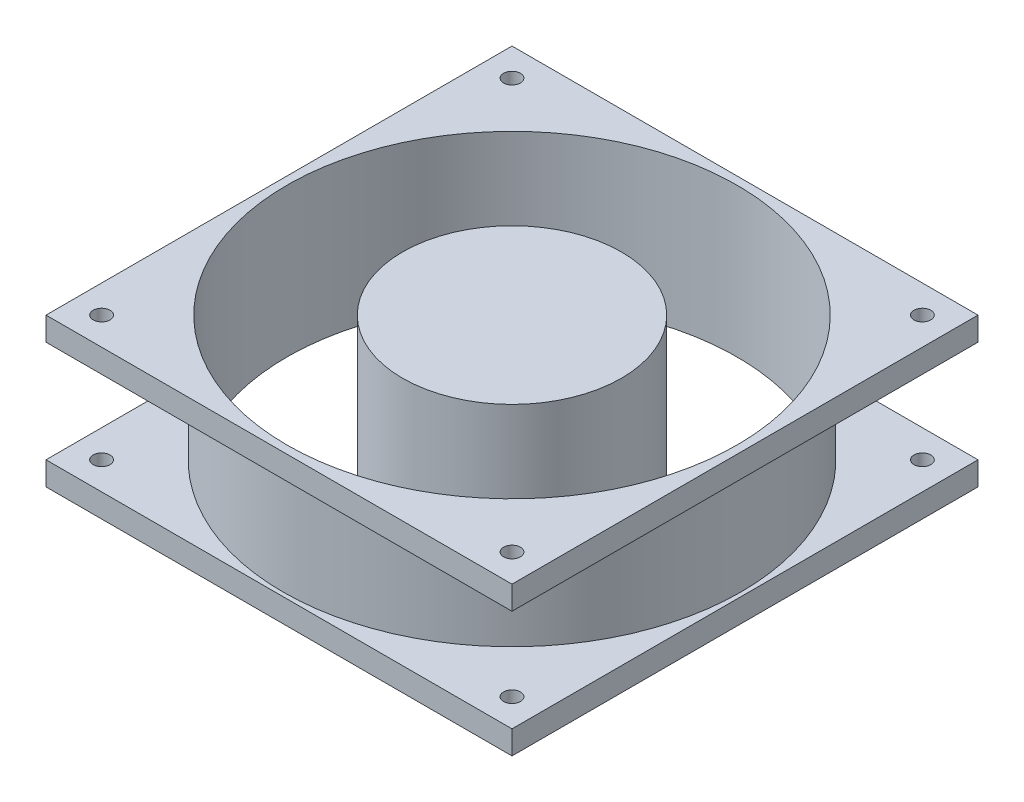
ISO-10303-21;
HEADER;
FILE_DESCRIPTION(('STEP AP214'),'2;1');
FILE_NAME('part.step','',(''),(''),'','','');
FILE_SCHEMA(('AUTOMOTIVE_DESIGN { 1 0 10303 214 1 1 1 1 }'));
ENDSEC;
DATA;
#1=APPLICATION_CONTEXT('core data for automotive mechanical design processes');
#2=APPLICATION_PROTOCOL_DEFINITION('international standard','automotive_design',2000,#1);
#3=PRODUCT_CONTEXT('',#1,'mechanical');
#4=PRODUCT('Part','Part','',(#3));
#5=PRODUCT_RELATED_PRODUCT_CATEGORY('part','',(#4));
#6=PRODUCT_DEFINITION_FORMATION('','',#4);
#7=PRODUCT_DEFINITION_CONTEXT('part definition',#1,'design');
#8=PRODUCT_DEFINITION('design','',#6,#7);
#9=PRODUCT_DEFINITION_SHAPE('','',#8);
#10=(LENGTH_UNIT() NAMED_UNIT(*) SI_UNIT(.MILLI.,.METRE.));
#11=(NAMED_UNIT(*) PLANE_ANGLE_UNIT() SI_UNIT($,.RADIAN.));
#12=(NAMED_UNIT(*) SI_UNIT($,.STERADIAN.) SOLID_ANGLE_UNIT());
#13=UNCERTAINTY_MEASURE_WITH_UNIT(LENGTH_MEASURE(1.E-05),#10,'distance_accuracy_value','');
#14=(GEOMETRIC_REPRESENTATION_CONTEXT(3) GLOBAL_UNCERTAINTY_ASSIGNED_CONTEXT((#13)) GLOBAL_UNIT_ASSIGNED_CONTEXT((#10,
#11,#12)) REPRESENTATION_CONTEXT('',''));
#15=CARTESIAN_POINT('',(0.,0.,0.));
#16=DIRECTION('',(0.,0.,1.));
#17=DIRECTION('',(1.,0.,0.));
#18=AXIS2_PLACEMENT_3D('',#15,#16,#17);
#19=CARTESIAN_POINT('',(0.,19.,0.));
#20=DIRECTION('',(0.,-1.,0.));
#21=DIRECTION('',(0.,0.,-1.));
#22=AXIS2_PLACEMENT_3D('',#19,#20,#21);
#23=CYLINDRICAL_SURFACE('',#22,27.94);
#24=CARTESIAN_POINT('',(0.,19.,0.));
#25=DIRECTION('',(0.,1.,0.));
#26=DIRECTION('',(0.,0.,1.));
#27=AXIS2_PLACEMENT_3D('',#24,#25,#26);
#28=CIRCLE('',#27,27.94);
#29=CARTESIAN_POINT('',(0.,19.,27.94));
#30=VERTEX_POINT('',#29);
#31=EDGE_CURVE('E11',#30,#30,#28,.T.);
#32=ORIENTED_EDGE('',*,*,#31,.F.);
#33=EDGE_LOOP('',(#32));
#34=FACE_BOUND('',#33,.T.);
#35=CARTESIAN_POINT('',(0.,-19.,0.));
#36=DIRECTION('',(0.,1.,0.));
#37=DIRECTION('',(0.,0.,1.));
#38=AXIS2_PLACEMENT_3D('',#35,#36,#37);
#39=CIRCLE('',#38,27.94);
#40=CARTESIAN_POINT('',(0.,-19.,27.94));
#41=VERTEX_POINT('',#40);
#42=EDGE_CURVE('E47',#41,#41,#39,.T.);
#43=ORIENTED_EDGE('',*,*,#42,.T.);
#44=EDGE_LOOP('',(#43));
#45=FACE_BOUND('',#44,.T.);
#46=ADVANCED_FACE('F44',(#34,#45),#23,.T.);
#47=CARTESIAN_POINT('',(0.,19.,0.));
#48=DIRECTION('',(0.,1.,0.));
#49=DIRECTION('',(0.,0.,1.));
#50=AXIS2_PLACEMENT_3D('',#47,#48,#49);
#51=PLANE('',#50);
#52=ORIENTED_EDGE('',*,*,#31,.T.);
#53=EDGE_LOOP('',(#52));
#54=FACE_BOUND('',#53,.T.);
#55=ADVANCED_FACE('F59',(#54),#51,.T.);
#56=CARTESIAN_POINT('',(0.,-19.,0.));
#57=DIRECTION('',(0.,1.,0.));
#58=DIRECTION('',(0.,0.,1.));
#59=AXIS2_PLACEMENT_3D('',#56,#57,#58);
#60=PLANE('',#59);
#61=ORIENTED_EDGE('',*,*,#42,.F.);
#62=EDGE_LOOP('',(#61));
#63=FACE_BOUND('',#62,.T.);
#64=ADVANCED_FACE('F57',(#63),#60,.F.);
#65=CLOSED_SHELL('',(#46,#55,#64));
#66=MANIFOLD_SOLID_BREP('B2',#65);
#67=CARTESIAN_POINT('',(0.,-13.,0.));
#68=DIRECTION('',(0.,1.,0.));
#69=DIRECTION('',(0.,0.,1.));
#70=AXIS2_PLACEMENT_3D('',#67,#68,#69);
#71=PLANE('',#70);
#72=DIRECTION('',(0.,0.,1.));
#73=VECTOR('',#72,1.);
#74=CARTESIAN_POINT('',(59.5,-13.,0.));
#75=LINE('',#74,#73);
#76=CARTESIAN_POINT('',(59.5,-13.,-59.5));
#77=VERTEX_POINT('',#76);
#78=CARTESIAN_POINT('',(59.5,-13.,59.5));
#79=VERTEX_POINT('',#78);
#80=EDGE_CURVE('E230',#77,#79,#75,.T.);
#81=ORIENTED_EDGE('',*,*,#80,.F.);
#82=DIRECTION('',(1.,0.,0.));
#83=VECTOR('',#82,1.);
#84=CARTESIAN_POINT('',(0.,-13.,-59.5));
#85=LINE('',#84,#83);
#86=CARTESIAN_POINT('',(-59.5,-13.,-59.5));
#87=VERTEX_POINT('',#86);
#88=EDGE_CURVE('E232',#87,#77,#85,.T.);
#89=ORIENTED_EDGE('',*,*,#88,.F.);
#90=DIRECTION('',(0.,0.,1.));
#91=VECTOR('',#90,1.);
#92=CARTESIAN_POINT('',(-59.5,-13.,0.));
#93=LINE('',#92,#91);
#94=CARTESIAN_POINT('',(-59.5,-13.,59.5));
#95=VERTEX_POINT('',#94);
#96=EDGE_CURVE('E235',#87,#95,#93,.T.);
#97=ORIENTED_EDGE('',*,*,#96,.T.);
#98=DIRECTION('',(1.,0.,0.));
#99=VECTOR('',#98,1.);
#100=CARTESIAN_POINT('',(0.,-13.,59.5));
#101=LINE('',#100,#99);
#102=EDGE_CURVE('E103',#95,#79,#101,.T.);
#103=ORIENTED_EDGE('',*,*,#102,.T.);
#104=EDGE_LOOP('',(#81,#89,#97,#103));
#105=FACE_BOUND('',#104,.T.);
#106=CARTESIAN_POINT('',(-52.4,-13.,-52.4));
#107=DIRECTION('',(0.,1.,0.));
#108=DIRECTION('',(0.,0.,1.));
#109=AXIS2_PLACEMENT_3D('',#106,#107,#108);
#110=CIRCLE('',#109,2.15);
#111=CARTESIAN_POINT('',(-52.4,-13.,-50.25));
#112=VERTEX_POINT('',#111);
#113=EDGE_CURVE('E227',#112,#112,#110,.T.);
#114=ORIENTED_EDGE('',*,*,#113,.F.);
#115=EDGE_LOOP('',(#114));
#116=FACE_BOUND('',#115,.T.);
#117=CARTESIAN_POINT('',(52.4,-13.,-52.4));
#118=DIRECTION('',(0.,1.,0.));
#119=DIRECTION('',(0.,0.,1.));
#120=AXIS2_PLACEMENT_3D('',#117,#118,#119);
#121=CIRCLE('',#120,2.15);
#122=CARTESIAN_POINT('',(52.4,-13.,-50.25));
#123=VERTEX_POINT('',#122);
#124=EDGE_CURVE('E224',#123,#123,#121,.T.);
#125=ORIENTED_EDGE('',*,*,#124,.F.);
#126=EDGE_LOOP('',(#125));
#127=FACE_BOUND('',#126,.T.);
#128=CARTESIAN_POINT('',(52.4,-13.,52.4));
#129=DIRECTION('',(0.,1.,0.));
#130=DIRECTION('',(0.,0.,1.));
#131=AXIS2_PLACEMENT_3D('',#128,#129,#130);
#132=CIRCLE('',#131,2.15);
#133=CARTESIAN_POINT('',(52.4,-13.,54.55));
#134=VERTEX_POINT('',#133);
#135=EDGE_CURVE('E221',#134,#134,#132,.T.);
#136=ORIENTED_EDGE('',*,*,#135,.F.);
#137=EDGE_LOOP('',(#136));
#138=FACE_BOUND('',#137,.T.);
#139=CARTESIAN_POINT('',(-52.4,-13.,52.4));
#140=DIRECTION('',(0.,1.,0.));
#141=DIRECTION('',(0.,0.,1.));
#142=AXIS2_PLACEMENT_3D('',#139,#140,#141);
#143=CIRCLE('',#142,2.15);
#144=CARTESIAN_POINT('',(-52.4,-13.,54.55));
#145=VERTEX_POINT('',#144);
#146=EDGE_CURVE('E218',#145,#145,#143,.T.);
#147=ORIENTED_EDGE('',*,*,#146,.F.);
#148=EDGE_LOOP('',(#147));
#149=FACE_BOUND('',#148,.T.);
#150=CARTESIAN_POINT('',(0.,-13.,0.));
#151=DIRECTION('',(0.,1.,0.));
#152=DIRECTION('',(0.,0.,1.));
#153=AXIS2_PLACEMENT_3D('',#150,#151,#152);
#154=CIRCLE('',#153,58.484);
#155=CARTESIAN_POINT('',(0.,-13.,58.484));
#156=VERTEX_POINT('',#155);
#157=EDGE_CURVE('E242',#156,#156,#154,.F.);
#158=ORIENTED_EDGE('',*,*,#157,.T.);
#159=EDGE_LOOP('',(#158));
#160=FACE_BOUND('',#159,.T.);
#161=ADVANCED_FACE('F84',(#105,#116,#127,#138,#149,#160),#71,.T.);
#162=CARTESIAN_POINT('',(59.5,-13.,0.));
#163=DIRECTION('',(1.,0.,0.));
#164=DIRECTION('',(0.,0.,-1.));
#165=AXIS2_PLACEMENT_3D('',#162,#163,#164);
#166=PLANE('',#165);
#167=DIRECTION('',(0.,0.,1.));
#168=VECTOR('',#167,1.);
#169=CARTESIAN_POINT('',(59.5,-19.,0.));
#170=LINE('',#169,#168);
#171=CARTESIAN_POINT('',(59.5,-19.,-59.5));
#172=VERTEX_POINT('',#171);
#173=CARTESIAN_POINT('',(59.5,-19.,59.5));
#174=VERTEX_POINT('',#173);
#175=EDGE_CURVE('E254',#172,#174,#170,.T.);
#176=ORIENTED_EDGE('',*,*,#175,.F.);
#177=DIRECTION('',(0.,-1.,0.));
#178=VECTOR('',#177,1.);
#179=CARTESIAN_POINT('',(59.5,-13.,-59.5));
#180=LINE('',#179,#178);
#181=EDGE_CURVE('E42',#77,#172,#180,.T.);
#182=ORIENTED_EDGE('',*,*,#181,.F.);
#183=ORIENTED_EDGE('',*,*,#80,.T.);
#184=DIRECTION('',(0.,-1.,0.));
#185=VECTOR('',#184,1.);
#186=CARTESIAN_POINT('',(59.5,-13.,59.5));
#187=LINE('',#186,#185);
#188=EDGE_CURVE('E127',#79,#174,#187,.T.);
#189=ORIENTED_EDGE('',*,*,#188,.T.);
#190=EDGE_LOOP('',(#176,#182,#183,#189));
#191=FACE_BOUND('',#190,.T.);
#192=ADVANCED_FACE('F286',(#191),#166,.T.);
#193=CARTESIAN_POINT('',(0.,-13.,-59.5));
#194=DIRECTION('',(0.,0.,-1.));
#195=DIRECTION('',(-1.,0.,0.));
#196=AXIS2_PLACEMENT_3D('',#193,#194,#195);
#197=PLANE('',#196);
#198=DIRECTION('',(1.,0.,0.));
#199=VECTOR('',#198,1.);
#200=CARTESIAN_POINT('',(0.,-19.,-59.5));
#201=LINE('',#200,#199);
#202=CARTESIAN_POINT('',(-59.5,-19.,-59.5));
#203=VERTEX_POINT('',#202);
#204=EDGE_CURVE('E256',#203,#172,#201,.T.);
#205=ORIENTED_EDGE('',*,*,#204,.F.);
#206=DIRECTION('',(0.,-1.,0.));
#207=VECTOR('',#206,1.);
#208=CARTESIAN_POINT('',(-59.5,-13.,-59.5));
#209=LINE('',#208,#207);
#210=EDGE_CURVE('E94',#87,#203,#209,.T.);
#211=ORIENTED_EDGE('',*,*,#210,.F.);
#212=ORIENTED_EDGE('',*,*,#88,.T.);
#213=ORIENTED_EDGE('',*,*,#181,.T.);
#214=EDGE_LOOP('',(#205,#211,#212,#213));
#215=FACE_BOUND('',#214,.T.);
#216=ADVANCED_FACE('F291',(#215),#197,.T.);
#217=CARTESIAN_POINT('',(-59.5,-13.,0.));
#218=DIRECTION('',(1.,0.,0.));
#219=DIRECTION('',(0.,0.,-1.));
#220=AXIS2_PLACEMENT_3D('',#217,#218,#219);
#221=PLANE('',#220);
#222=DIRECTION('',(0.,0.,1.));
#223=VECTOR('',#222,1.);
#224=CARTESIAN_POINT('',(-59.5,-19.,0.));
#225=LINE('',#224,#223);
#226=CARTESIAN_POINT('',(-59.5,-19.,59.5));
#227=VERTEX_POINT('',#226);
#228=EDGE_CURVE('E259',#203,#227,#225,.T.);
#229=ORIENTED_EDGE('',*,*,#228,.T.);
#230=DIRECTION('',(0.,-1.,0.));
#231=VECTOR('',#230,1.);
#232=CARTESIAN_POINT('',(-59.5,-13.,59.5));
#233=LINE('',#232,#231);
#234=EDGE_CURVE('E264',#95,#227,#233,.T.);
#235=ORIENTED_EDGE('',*,*,#234,.F.);
#236=ORIENTED_EDGE('',*,*,#96,.F.);
#237=ORIENTED_EDGE('',*,*,#210,.T.);
#238=EDGE_LOOP('',(#229,#235,#236,#237));
#239=FACE_BOUND('',#238,.T.);
#240=ADVANCED_FACE('F303',(#239),#221,.F.);
#241=CARTESIAN_POINT('',(0.,-13.,0.));
#242=DIRECTION('',(0.,-1.,0.));
#243=DIRECTION('',(0.,0.,-1.));
#244=AXIS2_PLACEMENT_3D('',#241,#242,#243);
#245=CYLINDRICAL_SURFACE('',#244,57.468);
#246=CARTESIAN_POINT('',(0.,-19.,0.));
#247=DIRECTION('',(0.,1.,0.));
#248=DIRECTION('',(0.,0.,1.));
#249=AXIS2_PLACEMENT_3D('',#246,#247,#248);
#250=CIRCLE('',#249,57.468);
#251=CARTESIAN_POINT('',(0.,-19.,57.468));
#252=VERTEX_POINT('',#251);
#253=EDGE_CURVE('E251',#252,#252,#250,.T.);
#254=ORIENTED_EDGE('',*,*,#253,.F.);
#255=EDGE_LOOP('',(#254));
#256=FACE_BOUND('',#255,.T.);
#257=CARTESIAN_POINT('',(0.,19.,0.));
#258=DIRECTION('',(0.,1.,0.));
#259=DIRECTION('',(0.,0.,1.));
#260=AXIS2_PLACEMENT_3D('',#257,#258,#259);
#261=CIRCLE('',#260,57.468);
#262=CARTESIAN_POINT('',(0.,19.,57.468));
#263=VERTEX_POINT('',#262);
#264=EDGE_CURVE('E202',#263,#263,#261,.T.);
#265=ORIENTED_EDGE('',*,*,#264,.T.);
#266=EDGE_LOOP('',(#265));
#267=FACE_BOUND('',#266,.T.);
#268=ADVANCED_FACE('F306',(#256,#267),#245,.F.);
#269=CARTESIAN_POINT('',(-52.4,-13.,-52.4));
#270=DIRECTION('',(0.,-1.,0.));
#271=DIRECTION('',(0.,0.,-1.));
#272=AXIS2_PLACEMENT_3D('',#269,#270,#271);
#273=CYLINDRICAL_SURFACE('',#272,2.15);
#274=ORIENTED_EDGE('',*,*,#113,.T.);
#275=EDGE_LOOP('',(#274));
#276=FACE_BOUND('',#275,.T.);
#277=CARTESIAN_POINT('',(-52.4,-19.,-52.4));
#278=DIRECTION('',(0.,1.,0.));
#279=DIRECTION('',(0.,0.,1.));
#280=AXIS2_PLACEMENT_3D('',#277,#278,#279);
#281=CIRCLE('',#280,2.15);
#282=CARTESIAN_POINT('',(-52.4,-19.,-50.25));
#283=VERTEX_POINT('',#282);
#284=EDGE_CURVE('E248',#283,#283,#281,.T.);
#285=ORIENTED_EDGE('',*,*,#284,.F.);
#286=EDGE_LOOP('',(#285));
#287=FACE_BOUND('',#286,.T.);
#288=ADVANCED_FACE('F313',(#276,#287),#273,.F.);
#289=CARTESIAN_POINT('',(52.4,-13.,-52.4));
#290=DIRECTION('',(0.,-1.,0.));
#291=DIRECTION('',(0.,0.,-1.));
#292=AXIS2_PLACEMENT_3D('',#289,#290,#291);
#293=CYLINDRICAL_SURFACE('',#292,2.15);
#294=ORIENTED_EDGE('',*,*,#124,.T.);
#295=EDGE_LOOP('',(#294));
#296=FACE_BOUND('',#295,.T.);
#297=CARTESIAN_POINT('',(52.4,-19.,-52.4));
#298=DIRECTION('',(0.,1.,0.));
#299=DIRECTION('',(0.,0.,1.));
#300=AXIS2_PLACEMENT_3D('',#297,#298,#299);
#301=CIRCLE('',#300,2.15);
#302=CARTESIAN_POINT('',(52.4,-19.,-50.25));
#303=VERTEX_POINT('',#302);
#304=EDGE_CURVE('E245',#303,#303,#301,.T.);
#305=ORIENTED_EDGE('',*,*,#304,.F.);
#306=EDGE_LOOP('',(#305));
#307=FACE_BOUND('',#306,.T.);
#308=ADVANCED_FACE('F317',(#296,#307),#293,.F.);
#309=CARTESIAN_POINT('',(52.4,-13.,52.4));
#310=DIRECTION('',(0.,-1.,0.));
#311=DIRECTION('',(0.,0.,-1.));
#312=AXIS2_PLACEMENT_3D('',#309,#310,#311);
#313=CYLINDRICAL_SURFACE('',#312,2.15);
#314=ORIENTED_EDGE('',*,*,#135,.T.);
#315=EDGE_LOOP('',(#314));
#316=FACE_BOUND('',#315,.T.);
#317=CARTESIAN_POINT('',(52.4,-19.,52.4));
#318=DIRECTION('',(0.,1.,0.));
#319=DIRECTION('',(0.,0.,1.));
#320=AXIS2_PLACEMENT_3D('',#317,#318,#319);
#321=CIRCLE('',#320,2.15);
#322=CARTESIAN_POINT('',(52.4,-19.,54.55));
#323=VERTEX_POINT('',#322);
#324=EDGE_CURVE('E241',#323,#323,#321,.T.);
#325=ORIENTED_EDGE('',*,*,#324,.F.);
#326=EDGE_LOOP('',(#325));
#327=FACE_BOUND('',#326,.T.);
#328=ADVANCED_FACE('F320',(#316,#327),#313,.F.);
#329=CARTESIAN_POINT('',(-52.4,-13.,52.4));
#330=DIRECTION('',(0.,-1.,0.));
#331=DIRECTION('',(0.,0.,-1.));
#332=AXIS2_PLACEMENT_3D('',#329,#330,#331);
#333=CYLINDRICAL_SURFACE('',#332,2.15);
#334=ORIENTED_EDGE('',*,*,#146,.T.);
#335=EDGE_LOOP('',(#334));
#336=FACE_BOUND('',#335,.T.);
#337=CARTESIAN_POINT('',(-52.4,-19.,52.4));
#338=DIRECTION('',(0.,1.,0.));
#339=DIRECTION('',(0.,0.,1.));
#340=AXIS2_PLACEMENT_3D('',#337,#338,#339);
#341=CIRCLE('',#340,2.15);
#342=CARTESIAN_POINT('',(-52.4,-19.,54.55));
#343=VERTEX_POINT('',#342);
#344=EDGE_CURVE('E238',#343,#343,#341,.T.);
#345=ORIENTED_EDGE('',*,*,#344,.F.);
#346=EDGE_LOOP('',(#345));
#347=FACE_BOUND('',#346,.T.);
#348=ADVANCED_FACE('F86',(#336,#347),#333,.F.);
#349=CARTESIAN_POINT('',(0.,-13.,59.5));
#350=DIRECTION('',(0.,0.,-1.));
#351=DIRECTION('',(-1.,0.,0.));
#352=AXIS2_PLACEMENT_3D('',#349,#350,#351);
#353=PLANE('',#352);
#354=DIRECTION('',(1.,0.,0.));
#355=VECTOR('',#354,1.);
#356=CARTESIAN_POINT('',(0.,-19.,59.5));
#357=LINE('',#356,#355);
#358=EDGE_CURVE('E120',#227,#174,#357,.T.);
#359=ORIENTED_EDGE('',*,*,#358,.T.);
#360=ORIENTED_EDGE('',*,*,#188,.F.);
#361=ORIENTED_EDGE('',*,*,#102,.F.);
#362=ORIENTED_EDGE('',*,*,#234,.T.);
#363=EDGE_LOOP('',(#359,#360,#361,#362));
#364=FACE_BOUND('',#363,.T.);
#365=ADVANCED_FACE('F298',(#364),#353,.F.);
#366=CARTESIAN_POINT('',(0.,-19.,0.));
#367=DIRECTION('',(0.,1.,0.));
#368=DIRECTION('',(0.,0.,1.));
#369=AXIS2_PLACEMENT_3D('',#366,#367,#368);
#370=PLANE('',#369);
#371=ORIENTED_EDGE('',*,*,#344,.T.);
#372=EDGE_LOOP('',(#371));
#373=FACE_BOUND('',#372,.T.);
#374=ORIENTED_EDGE('',*,*,#324,.T.);
#375=EDGE_LOOP('',(#374));
#376=FACE_BOUND('',#375,.T.);
#377=ORIENTED_EDGE('',*,*,#304,.T.);
#378=EDGE_LOOP('',(#377));
#379=FACE_BOUND('',#378,.T.);
#380=ORIENTED_EDGE('',*,*,#284,.T.);
#381=EDGE_LOOP('',(#380));
#382=FACE_BOUND('',#381,.T.);
#383=ORIENTED_EDGE('',*,*,#253,.T.);
#384=EDGE_LOOP('',(#383));
#385=FACE_BOUND('',#384,.T.);
#386=ORIENTED_EDGE('',*,*,#175,.T.);
#387=ORIENTED_EDGE('',*,*,#358,.F.);
#388=ORIENTED_EDGE('',*,*,#228,.F.);
#389=ORIENTED_EDGE('',*,*,#204,.T.);
#390=EDGE_LOOP('',(#386,#387,#388,#389));
#391=FACE_BOUND('',#390,.T.);
#392=ADVANCED_FACE('F282',(#373,#376,#379,#382,#385,#391),#370,.F.);
#393=CARTESIAN_POINT('',(0.,13.1,0.));
#394=DIRECTION('',(0.,-1.,0.));
#395=DIRECTION('',(0.,0.,-1.));
#396=AXIS2_PLACEMENT_3D('',#393,#394,#395);
#397=CYLINDRICAL_SURFACE('',#396,58.484);
#398=CARTESIAN_POINT('',(0.,13.,0.));
#399=DIRECTION('',(0.,-1.,0.));
#400=DIRECTION('',(0.,0.,-1.));
#401=AXIS2_PLACEMENT_3D('',#398,#399,#400);
#402=CIRCLE('',#401,58.484);
#403=CARTESIAN_POINT('',(0.,13.,-58.484));
#404=VERTEX_POINT('',#403);
#405=EDGE_CURVE('E88',#404,#404,#402,.T.);
#406=ORIENTED_EDGE('',*,*,#405,.T.);
#407=EDGE_LOOP('',(#406));
#408=FACE_BOUND('',#407,.T.);
#409=ORIENTED_EDGE('',*,*,#157,.F.);
#410=EDGE_LOOP('',(#409));
#411=FACE_BOUND('',#410,.T.);
#412=ADVANCED_FACE('F272',(#408,#411),#397,.T.);
#413=CARTESIAN_POINT('',(0.,13.,0.));
#414=DIRECTION('',(0.,-1.,0.));
#415=DIRECTION('',(0.,0.,1.));
#416=AXIS2_PLACEMENT_3D('',#413,#414,#415);
#417=PLANE('',#416);
#418=DIRECTION('',(0.,0.,1.));
#419=VECTOR('',#418,1.);
#420=CARTESIAN_POINT('',(59.5,13.,0.));
#421=LINE('',#420,#419);
#422=CARTESIAN_POINT('',(59.5,13.,-59.5));
#423=VERTEX_POINT('',#422);
#424=CARTESIAN_POINT('',(59.5,13.,59.5));
#425=VERTEX_POINT('',#424);
#426=EDGE_CURVE('E157',#423,#425,#421,.T.);
#427=ORIENTED_EDGE('',*,*,#426,.T.);
#428=DIRECTION('',(1.,0.,0.));
#429=VECTOR('',#428,1.);
#430=CARTESIAN_POINT('',(0.,13.,59.5));
#431=LINE('',#430,#429);
#432=CARTESIAN_POINT('',(-59.5,13.,59.5));
#433=VERTEX_POINT('',#432);
#434=EDGE_CURVE('E163',#433,#425,#431,.T.);
#435=ORIENTED_EDGE('',*,*,#434,.F.);
#436=DIRECTION('',(0.,0.,1.));
#437=VECTOR('',#436,1.);
#438=CARTESIAN_POINT('',(-59.5,13.,0.));
#439=LINE('',#438,#437);
#440=CARTESIAN_POINT('',(-59.5,13.,-59.5));
#441=VERTEX_POINT('',#440);
#442=EDGE_CURVE('E183',#441,#433,#439,.T.);
#443=ORIENTED_EDGE('',*,*,#442,.F.);
#444=DIRECTION('',(1.,0.,0.));
#445=VECTOR('',#444,1.);
#446=CARTESIAN_POINT('',(0.,13.,-59.5));
#447=LINE('',#446,#445);
#448=EDGE_CURVE('E166',#441,#423,#447,.T.);
#449=ORIENTED_EDGE('',*,*,#448,.T.);
#450=EDGE_LOOP('',(#427,#435,#443,#449));
#451=FACE_BOUND('',#450,.T.);
#452=CARTESIAN_POINT('',(-52.4,13.,-52.4));
#453=DIRECTION('',(0.,1.,0.));
#454=DIRECTION('',(0.,0.,1.));
#455=AXIS2_PLACEMENT_3D('',#452,#453,#454);
#456=CIRCLE('',#455,2.15);
#457=CARTESIAN_POINT('',(-52.4,13.,-50.25));
#458=VERTEX_POINT('',#457);
#459=EDGE_CURVE('E170',#458,#458,#456,.T.);
#460=ORIENTED_EDGE('',*,*,#459,.T.);
#461=EDGE_LOOP('',(#460));
#462=FACE_BOUND('',#461,.T.);
#463=CARTESIAN_POINT('',(52.4,13.,-52.4));
#464=DIRECTION('',(0.,1.,0.));
#465=DIRECTION('',(0.,0.,1.));
#466=AXIS2_PLACEMENT_3D('',#463,#464,#465);
#467=CIRCLE('',#466,2.15);
#468=CARTESIAN_POINT('',(52.4,13.,-50.25));
#469=VERTEX_POINT('',#468);
#470=EDGE_CURVE('E393',#469,#469,#467,.T.);
#471=ORIENTED_EDGE('',*,*,#470,.T.);
#472=EDGE_LOOP('',(#471));
#473=FACE_BOUND('',#472,.T.);
#474=CARTESIAN_POINT('',(52.4,13.,52.4));
#475=DIRECTION('',(0.,1.,0.));
#476=DIRECTION('',(0.,0.,1.));
#477=AXIS2_PLACEMENT_3D('',#474,#475,#476);
#478=CIRCLE('',#477,2.15);
#479=CARTESIAN_POINT('',(52.4,13.,54.55));
#480=VERTEX_POINT('',#479);
#481=EDGE_CURVE('E383',#480,#480,#478,.T.);
#482=ORIENTED_EDGE('',*,*,#481,.T.);
#483=EDGE_LOOP('',(#482));
#484=FACE_BOUND('',#483,.T.);
#485=CARTESIAN_POINT('',(-52.4,13.,52.4));
#486=DIRECTION('',(0.,1.,0.));
#487=DIRECTION('',(0.,0.,1.));
#488=AXIS2_PLACEMENT_3D('',#485,#486,#487);
#489=CIRCLE('',#488,2.15);
#490=CARTESIAN_POINT('',(-52.4,13.,54.55));
#491=VERTEX_POINT('',#490);
#492=EDGE_CURVE('E213',#491,#491,#489,.T.);
#493=ORIENTED_EDGE('',*,*,#492,.T.);
#494=EDGE_LOOP('',(#493));
#495=FACE_BOUND('',#494,.T.);
#496=ORIENTED_EDGE('',*,*,#405,.F.);
#497=EDGE_LOOP('',(#496));
#498=FACE_BOUND('',#497,.T.);
#499=ADVANCED_FACE('F159',(#451,#462,#473,#484,#495,#498),#417,.T.);
#500=CARTESIAN_POINT('',(59.5,13.,0.));
#501=DIRECTION('',(-1.,0.,0.));
#502=DIRECTION('',(0.,0.,1.));
#503=AXIS2_PLACEMENT_3D('',#500,#501,#502);
#504=PLANE('',#503);
#505=DIRECTION('',(0.,0.,1.));
#506=VECTOR('',#505,1.);
#507=CARTESIAN_POINT('',(59.5,19.,0.));
#508=LINE('',#507,#506);
#509=CARTESIAN_POINT('',(59.5,19.,-59.5));
#510=VERTEX_POINT('',#509);
#511=CARTESIAN_POINT('',(59.5,19.,59.5));
#512=VERTEX_POINT('',#511);
#513=EDGE_CURVE('E176',#510,#512,#508,.T.);
#514=ORIENTED_EDGE('',*,*,#513,.T.);
#515=DIRECTION('',(0.,1.,0.));
#516=VECTOR('',#515,1.);
#517=CARTESIAN_POINT('',(59.5,13.,59.5));
#518=LINE('',#517,#516);
#519=EDGE_CURVE('E173',#425,#512,#518,.T.);
#520=ORIENTED_EDGE('',*,*,#519,.F.);
#521=ORIENTED_EDGE('',*,*,#426,.F.);
#522=DIRECTION('',(0.,1.,0.));
#523=VECTOR('',#522,1.);
#524=CARTESIAN_POINT('',(59.5,13.,-59.5));
#525=LINE('',#524,#523);
#526=EDGE_CURVE('E189',#423,#510,#525,.T.);
#527=ORIENTED_EDGE('',*,*,#526,.T.);
#528=EDGE_LOOP('',(#514,#520,#521,#527));
#529=FACE_BOUND('',#528,.T.);
#530=ADVANCED_FACE('F174',(#529),#504,.F.);
#531=CARTESIAN_POINT('',(0.,13.,59.5));
#532=DIRECTION('',(0.,0.,1.));
#533=DIRECTION('',(1.,0.,0.));
#534=AXIS2_PLACEMENT_3D('',#531,#532,#533);
#535=PLANE('',#534);
#536=DIRECTION('',(1.,0.,0.));
#537=VECTOR('',#536,1.);
#538=CARTESIAN_POINT('',(0.,19.,59.5));
#539=LINE('',#538,#537);
#540=CARTESIAN_POINT('',(-59.5,19.,59.5));
#541=VERTEX_POINT('',#540);
#542=EDGE_CURVE('E206',#541,#512,#539,.T.);
#543=ORIENTED_EDGE('',*,*,#542,.F.);
#544=DIRECTION('',(0.,1.,0.));
#545=VECTOR('',#544,1.);
#546=CARTESIAN_POINT('',(-59.5,13.,59.5));
#547=LINE('',#546,#545);
#548=EDGE_CURVE('E180',#433,#541,#547,.T.);
#549=ORIENTED_EDGE('',*,*,#548,.F.);
#550=ORIENTED_EDGE('',*,*,#434,.T.);
#551=ORIENTED_EDGE('',*,*,#519,.T.);
#552=EDGE_LOOP('',(#543,#549,#550,#551));
#553=FACE_BOUND('',#552,.T.);
#554=ADVANCED_FACE('F182',(#553),#535,.T.);
#555=CARTESIAN_POINT('',(-59.5,13.,0.));
#556=DIRECTION('',(-1.,0.,0.));
#557=DIRECTION('',(0.,0.,1.));
#558=AXIS2_PLACEMENT_3D('',#555,#556,#557);
#559=PLANE('',#558);
#560=DIRECTION('',(0.,0.,1.));
#561=VECTOR('',#560,1.);
#562=CARTESIAN_POINT('',(-59.5,19.,0.));
#563=LINE('',#562,#561);
#564=CARTESIAN_POINT('',(-59.5,19.,-59.5));
#565=VERTEX_POINT('',#564);
#566=EDGE_CURVE('E208',#565,#541,#563,.T.);
#567=ORIENTED_EDGE('',*,*,#566,.F.);
#568=DIRECTION('',(0.,1.,0.));
#569=VECTOR('',#568,1.);
#570=CARTESIAN_POINT('',(-59.5,13.,-59.5));
#571=LINE('',#570,#569);
#572=EDGE_CURVE('E215',#441,#565,#571,.T.);
#573=ORIENTED_EDGE('',*,*,#572,.F.);
#574=ORIENTED_EDGE('',*,*,#442,.T.);
#575=ORIENTED_EDGE('',*,*,#548,.T.);
#576=EDGE_LOOP('',(#567,#573,#574,#575));
#577=FACE_BOUND('',#576,.T.);
#578=ADVANCED_FACE('F353',(#577),#559,.T.);
#579=CARTESIAN_POINT('',(-52.4,13.,-52.4));
#580=DIRECTION('',(0.,1.,0.));
#581=DIRECTION('',(0.,0.,1.));
#582=AXIS2_PLACEMENT_3D('',#579,#580,#581);
#583=CYLINDRICAL_SURFACE('',#582,2.15);
#584=ORIENTED_EDGE('',*,*,#459,.F.);
#585=EDGE_LOOP('',(#584));
#586=FACE_BOUND('',#585,.T.);
#587=CARTESIAN_POINT('',(-52.4,19.,-52.4));
#588=DIRECTION('',(0.,1.,0.));
#589=DIRECTION('',(0.,0.,1.));
#590=AXIS2_PLACEMENT_3D('',#587,#588,#589);
#591=CIRCLE('',#590,2.15);
#592=CARTESIAN_POINT('',(-52.4,19.,-50.25));
#593=VERTEX_POINT('',#592);
#594=EDGE_CURVE('E199',#593,#593,#591,.T.);
#595=ORIENTED_EDGE('',*,*,#594,.T.);
#596=EDGE_LOOP('',(#595));
#597=FACE_BOUND('',#596,.T.);
#598=ADVANCED_FACE('F366',(#586,#597),#583,.F.);
#599=CARTESIAN_POINT('',(52.4,13.,-52.4));
#600=DIRECTION('',(0.,1.,0.));
#601=DIRECTION('',(0.,0.,1.));
#602=AXIS2_PLACEMENT_3D('',#599,#600,#601);
#603=CYLINDRICAL_SURFACE('',#602,2.15);
#604=ORIENTED_EDGE('',*,*,#470,.F.);
#605=EDGE_LOOP('',(#604));
#606=FACE_BOUND('',#605,.T.);
#607=CARTESIAN_POINT('',(52.4,19.,-52.4));
#608=DIRECTION('',(0.,1.,0.));
#609=DIRECTION('',(0.,0.,1.));
#610=AXIS2_PLACEMENT_3D('',#607,#608,#609);
#611=CIRCLE('',#610,2.15);
#612=CARTESIAN_POINT('',(52.4,19.,-50.25));
#613=VERTEX_POINT('',#612);
#614=EDGE_CURVE('E196',#613,#613,#611,.T.);
#615=ORIENTED_EDGE('',*,*,#614,.T.);
#616=EDGE_LOOP('',(#615));
#617=FACE_BOUND('',#616,.T.);
#618=ADVANCED_FACE('F371',(#606,#617),#603,.F.);
#619=CARTESIAN_POINT('',(52.4,13.,52.4));
#620=DIRECTION('',(0.,1.,0.));
#621=DIRECTION('',(0.,0.,1.));
#622=AXIS2_PLACEMENT_3D('',#619,#620,#621);
#623=CYLINDRICAL_SURFACE('',#622,2.15);
#624=ORIENTED_EDGE('',*,*,#481,.F.);
#625=EDGE_LOOP('',(#624));
#626=FACE_BOUND('',#625,.T.);
#627=CARTESIAN_POINT('',(52.4,19.,52.4));
#628=DIRECTION('',(0.,1.,0.));
#629=DIRECTION('',(0.,0.,1.));
#630=AXIS2_PLACEMENT_3D('',#627,#628,#629);
#631=CIRCLE('',#630,2.15);
#632=CARTESIAN_POINT('',(52.4,19.,54.55));
#633=VERTEX_POINT('',#632);
#634=EDGE_CURVE('E193',#633,#633,#631,.T.);
#635=ORIENTED_EDGE('',*,*,#634,.T.);
#636=EDGE_LOOP('',(#635));
#637=FACE_BOUND('',#636,.T.);
#638=ADVANCED_FACE('F361',(#626,#637),#623,.F.);
#639=CARTESIAN_POINT('',(-52.4,13.,52.4));
#640=DIRECTION('',(0.,1.,0.));
#641=DIRECTION('',(0.,0.,1.));
#642=AXIS2_PLACEMENT_3D('',#639,#640,#641);
#643=CYLINDRICAL_SURFACE('',#642,2.15);
#644=ORIENTED_EDGE('',*,*,#492,.F.);
#645=EDGE_LOOP('',(#644));
#646=FACE_BOUND('',#645,.T.);
#647=CARTESIAN_POINT('',(-52.4,19.,52.4));
#648=DIRECTION('',(0.,1.,0.));
#649=DIRECTION('',(0.,0.,1.));
#650=AXIS2_PLACEMENT_3D('',#647,#648,#649);
#651=CIRCLE('',#650,2.15);
#652=CARTESIAN_POINT('',(-52.4,19.,54.55));
#653=VERTEX_POINT('',#652);
#654=EDGE_CURVE('E190',#653,#653,#651,.T.);
#655=ORIENTED_EDGE('',*,*,#654,.T.);
#656=EDGE_LOOP('',(#655));
#657=FACE_BOUND('',#656,.T.);
#658=ADVANCED_FACE('F356',(#646,#657),#643,.F.);
#659=CARTESIAN_POINT('',(0.,13.,-59.5));
#660=DIRECTION('',(0.,0.,1.));
#661=DIRECTION('',(1.,0.,0.));
#662=AXIS2_PLACEMENT_3D('',#659,#660,#661);
#663=PLANE('',#662);
#664=DIRECTION('',(1.,0.,0.));
#665=VECTOR('',#664,1.);
#666=CARTESIAN_POINT('',(0.,19.,-59.5));
#667=LINE('',#666,#665);
#668=EDGE_CURVE('E211',#565,#510,#667,.T.);
#669=ORIENTED_EDGE('',*,*,#668,.T.);
#670=ORIENTED_EDGE('',*,*,#526,.F.);
#671=ORIENTED_EDGE('',*,*,#448,.F.);
#672=ORIENTED_EDGE('',*,*,#572,.T.);
#673=EDGE_LOOP('',(#669,#670,#671,#672));
#674=FACE_BOUND('',#673,.T.);
#675=ADVANCED_FACE('F348',(#674),#663,.F.);
#676=CARTESIAN_POINT('',(0.,19.,0.));
#677=DIRECTION('',(0.,-1.,0.));
#678=DIRECTION('',(0.,0.,1.));
#679=AXIS2_PLACEMENT_3D('',#676,#677,#678);
#680=PLANE('',#679);
#681=ORIENTED_EDGE('',*,*,#654,.F.);
#682=EDGE_LOOP('',(#681));
#683=FACE_BOUND('',#682,.T.);
#684=ORIENTED_EDGE('',*,*,#634,.F.);
#685=EDGE_LOOP('',(#684));
#686=FACE_BOUND('',#685,.T.);
#687=ORIENTED_EDGE('',*,*,#614,.F.);
#688=EDGE_LOOP('',(#687));
#689=FACE_BOUND('',#688,.T.);
#690=ORIENTED_EDGE('',*,*,#594,.F.);
#691=EDGE_LOOP('',(#690));
#692=FACE_BOUND('',#691,.T.);
#693=ORIENTED_EDGE('',*,*,#264,.F.);
#694=EDGE_LOOP('',(#693));
#695=FACE_BOUND('',#694,.T.);
#696=ORIENTED_EDGE('',*,*,#513,.F.);
#697=ORIENTED_EDGE('',*,*,#668,.F.);
#698=ORIENTED_EDGE('',*,*,#566,.T.);
#699=ORIENTED_EDGE('',*,*,#542,.T.);
#700=EDGE_LOOP('',(#696,#697,#698,#699));
#701=FACE_BOUND('',#700,.T.);
#702=ADVANCED_FACE('F345',(#683,#686,#689,#692,#695,#701),#680,.F.);
#703=CLOSED_SHELL('',(#161,#192,#216,#240,#268,#288,#308,#328,#348,#365,#392,#412,#499,#530,
#554,#578,#598,#618,#638,#658,#675,#702));
#704=MANIFOLD_SOLID_BREP('B6',#703);
#705=ADVANCED_BREP_SHAPE_REPRESENTATION('',(#18,#66,#704),#14);
#706=SHAPE_DEFINITION_REPRESENTATION(#9,#705);
ENDSEC;
END-ISO-10303-21;
